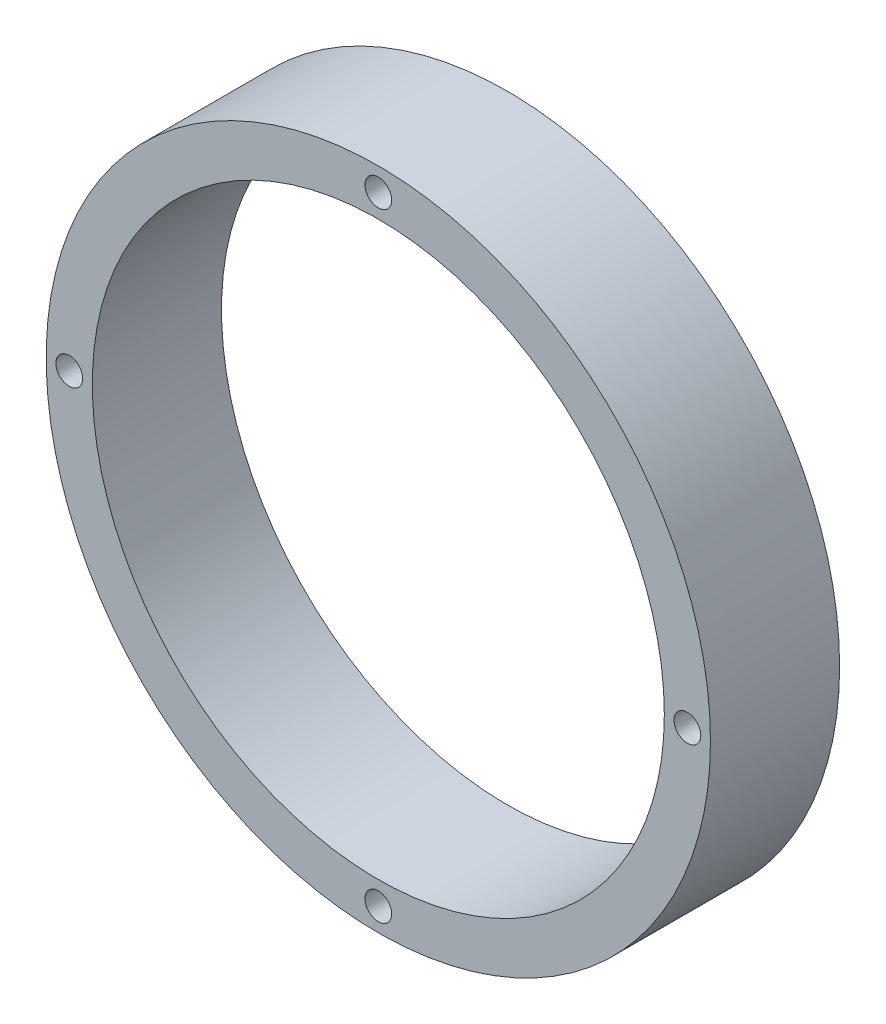
ISO-10303-21;
HEADER;
FILE_DESCRIPTION(('STEP AP214'),'2;1');
FILE_NAME('part.step','',(''),(''),'','','');
FILE_SCHEMA(('AUTOMOTIVE_DESIGN { 1 0 10303 214 1 1 1 1 }'));
ENDSEC;
DATA;
#1=APPLICATION_CONTEXT('core data for automotive mechanical design processes');
#2=APPLICATION_PROTOCOL_DEFINITION('international standard','automotive_design',2000,#1);
#3=PRODUCT_CONTEXT('',#1,'mechanical');
#4=PRODUCT('Part','Part','',(#3));
#5=PRODUCT_RELATED_PRODUCT_CATEGORY('part','',(#4));
#6=PRODUCT_DEFINITION_FORMATION('','',#4);
#7=PRODUCT_DEFINITION_CONTEXT('part definition',#1,'design');
#8=PRODUCT_DEFINITION('design','',#6,#7);
#9=PRODUCT_DEFINITION_SHAPE('','',#8);
#10=(LENGTH_UNIT() NAMED_UNIT(*) SI_UNIT(.MILLI.,.METRE.));
#11=(NAMED_UNIT(*) PLANE_ANGLE_UNIT() SI_UNIT($,.RADIAN.));
#12=(NAMED_UNIT(*) SI_UNIT($,.STERADIAN.) SOLID_ANGLE_UNIT());
#13=UNCERTAINTY_MEASURE_WITH_UNIT(LENGTH_MEASURE(1.E-05),#10,'distance_accuracy_value','');
#14=(GEOMETRIC_REPRESENTATION_CONTEXT(3) GLOBAL_UNCERTAINTY_ASSIGNED_CONTEXT((#13)) GLOBAL_UNIT_ASSIGNED_CONTEXT((#10,
#11,#12)) REPRESENTATION_CONTEXT('',''));
#15=CARTESIAN_POINT('',(0.,0.,0.));
#16=DIRECTION('',(0.,0.,1.));
#17=DIRECTION('',(1.,0.,0.));
#18=AXIS2_PLACEMENT_3D('',#15,#16,#17);
#19=CARTESIAN_POINT('',(0.,0.,14.));
#20=DIRECTION('',(0.,0.,1.));
#21=DIRECTION('',(1.,0.,0.));
#22=AXIS2_PLACEMENT_3D('',#19,#20,#21);
#23=PLANE('',#22);
#24=CARTESIAN_POINT('',(-33.5,-1.16964624851245E-13,14.));
#25=DIRECTION('',(0.,0.,1.));
#26=DIRECTION('',(0.,1.,0.));
#27=AXIS2_PLACEMENT_3D('',#24,#25,#26);
#28=CIRCLE('',#27,1.45);
#29=CARTESIAN_POINT('',(-33.5,1.44999999999988,14.));
#30=VERTEX_POINT('',#29);
#31=EDGE_CURVE('E70',#30,#30,#28,.T.);
#32=ORIENTED_EDGE('',*,*,#31,.F.);
#33=EDGE_LOOP('',(#32));
#34=FACE_BOUND('',#33,.T.);
#35=CARTESIAN_POINT('',(0.,-33.5,14.));
#36=DIRECTION('',(0.,0.,1.));
#37=DIRECTION('',(-1.,0.,0.));
#38=AXIS2_PLACEMENT_3D('',#35,#36,#37);
#39=CIRCLE('',#38,1.45);
#40=CARTESIAN_POINT('',(-1.45,-33.5,14.));
#41=VERTEX_POINT('',#40);
#42=EDGE_CURVE('E64',#41,#41,#39,.T.);
#43=ORIENTED_EDGE('',*,*,#42,.F.);
#44=EDGE_LOOP('',(#43));
#45=FACE_BOUND('',#44,.T.);
#46=CARTESIAN_POINT('',(33.5,3.50893874553735E-13,14.));
#47=DIRECTION('',(0.,0.,1.));
#48=DIRECTION('',(0.,-1.,0.));
#49=AXIS2_PLACEMENT_3D('',#46,#47,#48);
#50=CIRCLE('',#49,1.45);
#51=CARTESIAN_POINT('',(33.5,-1.44999999999965,14.));
#52=VERTEX_POINT('',#51);
#53=EDGE_CURVE('E58',#52,#52,#50,.T.);
#54=ORIENTED_EDGE('',*,*,#53,.F.);
#55=EDGE_LOOP('',(#54));
#56=FACE_BOUND('',#55,.T.);
#57=CARTESIAN_POINT('',(0.,33.5,14.));
#58=DIRECTION('',(0.,0.,1.));
#59=DIRECTION('',(1.,0.,0.));
#60=AXIS2_PLACEMENT_3D('',#57,#58,#59);
#61=CIRCLE('',#60,1.45);
#62=CARTESIAN_POINT('',(1.45,33.5,14.));
#63=VERTEX_POINT('',#62);
#64=EDGE_CURVE('E52',#63,#63,#61,.T.);
#65=ORIENTED_EDGE('',*,*,#64,.F.);
#66=EDGE_LOOP('',(#65));
#67=FACE_BOUND('',#66,.T.);
#68=CARTESIAN_POINT('',(0.,0.,14.));
#69=DIRECTION('',(0.,0.,1.));
#70=DIRECTION('',(1.,0.,0.));
#71=AXIS2_PLACEMENT_3D('',#68,#69,#70);
#72=CIRCLE('',#71,36.);
#73=CARTESIAN_POINT('',(36.,0.,14.));
#74=VERTEX_POINT('',#73);
#75=EDGE_CURVE('E10',#74,#74,#72,.T.);
#76=ORIENTED_EDGE('',*,*,#75,.T.);
#77=EDGE_LOOP('',(#76));
#78=FACE_BOUND('',#77,.T.);
#79=CARTESIAN_POINT('',(0.,0.,14.));
#80=DIRECTION('',(0.,0.,1.));
#81=DIRECTION('',(1.,0.,0.));
#82=AXIS2_PLACEMENT_3D('',#79,#80,#81);
#83=CIRCLE('',#82,31.);
#84=CARTESIAN_POINT('',(31.,0.,14.));
#85=VERTEX_POINT('',#84);
#86=EDGE_CURVE('E44',#85,#85,#83,.T.);
#87=ORIENTED_EDGE('',*,*,#86,.F.);
#88=EDGE_LOOP('',(#87));
#89=FACE_BOUND('',#88,.T.);
#90=ADVANCED_FACE('F33',(#34,#45,#56,#67,#78,#89),#23,.T.);
#91=CARTESIAN_POINT('',(0.,0.,0.));
#92=DIRECTION('',(0.,0.,1.));
#93=DIRECTION('',(1.,0.,0.));
#94=AXIS2_PLACEMENT_3D('',#91,#92,#93);
#95=PLANE('',#94);
#96=CARTESIAN_POINT('',(-33.5,-1.16964624851245E-13,0.));
#97=DIRECTION('',(0.,0.,1.));
#98=DIRECTION('',(0.,1.,0.));
#99=AXIS2_PLACEMENT_3D('',#96,#97,#98);
#100=CIRCLE('',#99,1.45);
#101=CARTESIAN_POINT('',(-33.5,1.44999999999988,0.));
#102=VERTEX_POINT('',#101);
#103=EDGE_CURVE('E55',#102,#102,#100,.T.);
#104=ORIENTED_EDGE('',*,*,#103,.T.);
#105=EDGE_LOOP('',(#104));
#106=FACE_BOUND('',#105,.T.);
#107=CARTESIAN_POINT('',(0.,-33.5,0.));
#108=DIRECTION('',(0.,0.,1.));
#109=DIRECTION('',(-1.,0.,0.));
#110=AXIS2_PLACEMENT_3D('',#107,#108,#109);
#111=CIRCLE('',#110,1.45);
#112=CARTESIAN_POINT('',(-1.45,-33.5,0.));
#113=VERTEX_POINT('',#112);
#114=EDGE_CURVE('E67',#113,#113,#111,.T.);
#115=ORIENTED_EDGE('',*,*,#114,.T.);
#116=EDGE_LOOP('',(#115));
#117=FACE_BOUND('',#116,.T.);
#118=CARTESIAN_POINT('',(33.5,3.50893874553735E-13,0.));
#119=DIRECTION('',(0.,0.,1.));
#120=DIRECTION('',(0.,-1.,0.));
#121=AXIS2_PLACEMENT_3D('',#118,#119,#120);
#122=CIRCLE('',#121,1.45);
#123=CARTESIAN_POINT('',(33.5,-1.44999999999965,0.));
#124=VERTEX_POINT('',#123);
#125=EDGE_CURVE('E61',#124,#124,#122,.T.);
#126=ORIENTED_EDGE('',*,*,#125,.T.);
#127=EDGE_LOOP('',(#126));
#128=FACE_BOUND('',#127,.T.);
#129=CARTESIAN_POINT('',(0.,33.5,0.));
#130=DIRECTION('',(0.,0.,1.));
#131=DIRECTION('',(1.,0.,0.));
#132=AXIS2_PLACEMENT_3D('',#129,#130,#131);
#133=CIRCLE('',#132,1.45);
#134=CARTESIAN_POINT('',(1.45,33.5,0.));
#135=VERTEX_POINT('',#134);
#136=EDGE_CURVE('E49',#135,#135,#133,.T.);
#137=ORIENTED_EDGE('',*,*,#136,.T.);
#138=EDGE_LOOP('',(#137));
#139=FACE_BOUND('',#138,.T.);
#140=CARTESIAN_POINT('',(0.,0.,0.));
#141=DIRECTION('',(0.,0.,1.));
#142=DIRECTION('',(1.,0.,0.));
#143=AXIS2_PLACEMENT_3D('',#140,#141,#142);
#144=CIRCLE('',#143,36.);
#145=CARTESIAN_POINT('',(36.,0.,0.));
#146=VERTEX_POINT('',#145);
#147=EDGE_CURVE('E37',#146,#146,#144,.T.);
#148=ORIENTED_EDGE('',*,*,#147,.F.);
#149=EDGE_LOOP('',(#148));
#150=FACE_BOUND('',#149,.T.);
#151=CARTESIAN_POINT('',(0.,0.,0.));
#152=DIRECTION('',(0.,0.,1.));
#153=DIRECTION('',(1.,0.,0.));
#154=AXIS2_PLACEMENT_3D('',#151,#152,#153);
#155=CIRCLE('',#154,31.);
#156=CARTESIAN_POINT('',(31.,0.,0.));
#157=VERTEX_POINT('',#156);
#158=EDGE_CURVE('E46',#157,#157,#155,.T.);
#159=ORIENTED_EDGE('',*,*,#158,.T.);
#160=EDGE_LOOP('',(#159));
#161=FACE_BOUND('',#160,.T.);
#162=ADVANCED_FACE('F76',(#106,#117,#128,#139,#150,#161),#95,.F.);
#163=CARTESIAN_POINT('',(0.,0.,14.));
#164=DIRECTION('',(0.,0.,-1.));
#165=DIRECTION('',(-1.,0.,0.));
#166=AXIS2_PLACEMENT_3D('',#163,#164,#165);
#167=CYLINDRICAL_SURFACE('',#166,36.);
#168=ORIENTED_EDGE('',*,*,#75,.F.);
#169=EDGE_LOOP('',(#168));
#170=FACE_BOUND('',#169,.T.);
#171=ORIENTED_EDGE('',*,*,#147,.T.);
#172=EDGE_LOOP('',(#171));
#173=FACE_BOUND('',#172,.T.);
#174=ADVANCED_FACE('F35',(#170,#173),#167,.T.);
#175=CARTESIAN_POINT('',(0.,0.,14.));
#176=DIRECTION('',(0.,0.,-1.));
#177=DIRECTION('',(-1.,0.,0.));
#178=AXIS2_PLACEMENT_3D('',#175,#176,#177);
#179=CYLINDRICAL_SURFACE('',#178,31.);
#180=ORIENTED_EDGE('',*,*,#86,.T.);
#181=EDGE_LOOP('',(#180));
#182=FACE_BOUND('',#181,.T.);
#183=ORIENTED_EDGE('',*,*,#158,.F.);
#184=EDGE_LOOP('',(#183));
#185=FACE_BOUND('',#184,.T.);
#186=ADVANCED_FACE('F97',(#182,#185),#179,.F.);
#187=CARTESIAN_POINT('',(0.,33.5,0.));
#188=DIRECTION('',(0.,0.,1.));
#189=DIRECTION('',(1.,0.,0.));
#190=AXIS2_PLACEMENT_3D('',#187,#188,#189);
#191=CYLINDRICAL_SURFACE('',#190,1.45);
#192=ORIENTED_EDGE('',*,*,#136,.F.);
#193=EDGE_LOOP('',(#192));
#194=FACE_BOUND('',#193,.T.);
#195=ORIENTED_EDGE('',*,*,#64,.T.);
#196=EDGE_LOOP('',(#195));
#197=FACE_BOUND('',#196,.T.);
#198=ADVANCED_FACE('F100',(#194,#197),#191,.F.);
#199=CARTESIAN_POINT('',(33.5,3.50893874553735E-13,0.));
#200=DIRECTION('',(0.,0.,1.));
#201=DIRECTION('',(1.,0.,0.));
#202=AXIS2_PLACEMENT_3D('',#199,#200,#201);
#203=CYLINDRICAL_SURFACE('',#202,1.45);
#204=ORIENTED_EDGE('',*,*,#125,.F.);
#205=EDGE_LOOP('',(#204));
#206=FACE_BOUND('',#205,.T.);
#207=ORIENTED_EDGE('',*,*,#53,.T.);
#208=EDGE_LOOP('',(#207));
#209=FACE_BOUND('',#208,.T.);
#210=ADVANCED_FACE('F112',(#206,#209),#203,.F.);
#211=CARTESIAN_POINT('',(0.,-33.5,0.));
#212=DIRECTION('',(0.,0.,1.));
#213=DIRECTION('',(1.,0.,0.));
#214=AXIS2_PLACEMENT_3D('',#211,#212,#213);
#215=CYLINDRICAL_SURFACE('',#214,1.45);
#216=ORIENTED_EDGE('',*,*,#114,.F.);
#217=EDGE_LOOP('',(#216));
#218=FACE_BOUND('',#217,.T.);
#219=ORIENTED_EDGE('',*,*,#42,.T.);
#220=EDGE_LOOP('',(#219));
#221=FACE_BOUND('',#220,.T.);
#222=ADVANCED_FACE('F82',(#218,#221),#215,.F.);
#223=CARTESIAN_POINT('',(-33.5,-1.16964624851245E-13,0.));
#224=DIRECTION('',(0.,0.,1.));
#225=DIRECTION('',(1.,0.,0.));
#226=AXIS2_PLACEMENT_3D('',#223,#224,#225);
#227=CYLINDRICAL_SURFACE('',#226,1.45);
#228=ORIENTED_EDGE('',*,*,#103,.F.);
#229=EDGE_LOOP('',(#228));
#230=FACE_BOUND('',#229,.T.);
#231=ORIENTED_EDGE('',*,*,#31,.T.);
#232=EDGE_LOOP('',(#231));
#233=FACE_BOUND('',#232,.T.);
#234=ADVANCED_FACE('F79',(#230,#233),#227,.F.);
#235=CLOSED_SHELL('',(#90,#162,#174,#186,#198,#210,#222,#234));
#236=MANIFOLD_SOLID_BREP('B2',#235);
#237=ADVANCED_BREP_SHAPE_REPRESENTATION('',(#18,#236),#14);
#238=SHAPE_DEFINITION_REPRESENTATION(#9,#237);
ENDSEC;
END-ISO-10303-21;
